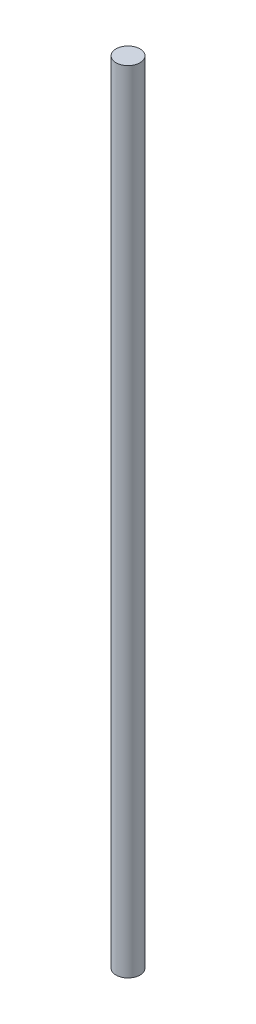
ISO-10303-21;
HEADER;
FILE_DESCRIPTION(('STEP AP214'),'2;1');
FILE_NAME('part.step','',(''),(''),'','','');
FILE_SCHEMA(('AUTOMOTIVE_DESIGN { 1 0 10303 214 1 1 1 1 }'));
ENDSEC;
DATA;
#1=APPLICATION_CONTEXT('core data for automotive mechanical design processes');
#2=APPLICATION_PROTOCOL_DEFINITION('international standard','automotive_design',2000,#1);
#3=PRODUCT_CONTEXT('',#1,'mechanical');
#4=PRODUCT('Part','Part','',(#3));
#5=PRODUCT_RELATED_PRODUCT_CATEGORY('part','',(#4));
#6=PRODUCT_DEFINITION_FORMATION('','',#4);
#7=PRODUCT_DEFINITION_CONTEXT('part definition',#1,'design');
#8=PRODUCT_DEFINITION('design','',#6,#7);
#9=PRODUCT_DEFINITION_SHAPE('','',#8);
#10=(LENGTH_UNIT() NAMED_UNIT(*) SI_UNIT(.MILLI.,.METRE.));
#11=(NAMED_UNIT(*) PLANE_ANGLE_UNIT() SI_UNIT($,.RADIAN.));
#12=(NAMED_UNIT(*) SI_UNIT($,.STERADIAN.) SOLID_ANGLE_UNIT());
#13=UNCERTAINTY_MEASURE_WITH_UNIT(LENGTH_MEASURE(1.E-05),#10,'distance_accuracy_value','');
#14=(GEOMETRIC_REPRESENTATION_CONTEXT(3) GLOBAL_UNCERTAINTY_ASSIGNED_CONTEXT((#13)) GLOBAL_UNIT_ASSIGNED_CONTEXT((#10,
#11,#12)) REPRESENTATION_CONTEXT('',''));
#15=CARTESIAN_POINT('',(0.,0.,0.));
#16=DIRECTION('',(0.,0.,1.));
#17=DIRECTION('',(1.,0.,0.));
#18=AXIS2_PLACEMENT_3D('',#15,#16,#17);
#19=CARTESIAN_POINT('',(21.,0.,18.));
#20=DIRECTION('',(0.,-1.,0.));
#21=DIRECTION('',(0.,0.,-1.));
#22=AXIS2_PLACEMENT_3D('',#19,#20,#21);
#23=PLANE('',#22);
#24=CARTESIAN_POINT('',(21.,0.,18.));
#25=DIRECTION('',(0.,-1.,0.));
#26=DIRECTION('',(0.,0.,-1.));
#27=AXIS2_PLACEMENT_3D('',#24,#25,#26);
#28=CIRCLE('',#27,6.);
#29=CARTESIAN_POINT('',(21.,0.,12.));
#30=VERTEX_POINT('',#29);
#31=EDGE_CURVE('E20',#30,#30,#28,.F.);
#32=ORIENTED_EDGE('',*,*,#31,.F.);
#33=EDGE_LOOP('',(#32));
#34=FACE_BOUND('',#33,.T.);
#35=ADVANCED_FACE('F16',(#34),#23,.T.);
#36=CARTESIAN_POINT('',(21.,395.,18.));
#37=DIRECTION('',(0.,1.,0.));
#38=DIRECTION('',(0.,0.,1.));
#39=AXIS2_PLACEMENT_3D('',#36,#37,#38);
#40=PLANE('',#39);
#41=CARTESIAN_POINT('',(21.,395.,18.));
#42=DIRECTION('',(0.,-1.,0.));
#43=DIRECTION('',(0.,0.,-1.));
#44=AXIS2_PLACEMENT_3D('',#41,#42,#43);
#45=CIRCLE('',#44,6.);
#46=CARTESIAN_POINT('',(21.,395.,12.));
#47=VERTEX_POINT('',#46);
#48=EDGE_CURVE('E11',#47,#47,#45,.T.);
#49=ORIENTED_EDGE('',*,*,#48,.F.);
#50=EDGE_LOOP('',(#49));
#51=FACE_BOUND('',#50,.T.);
#52=ADVANCED_FACE('F35',(#51),#40,.T.);
#53=CARTESIAN_POINT('',(21.,197.5,18.));
#54=DIRECTION('',(0.,-1.,0.));
#55=DIRECTION('',(0.,0.,-1.));
#56=AXIS2_PLACEMENT_3D('',#53,#54,#55);
#57=CYLINDRICAL_SURFACE('',#56,6.);
#58=ORIENTED_EDGE('',*,*,#31,.T.);
#59=EDGE_LOOP('',(#58));
#60=FACE_BOUND('',#59,.T.);
#61=ORIENTED_EDGE('',*,*,#48,.T.);
#62=EDGE_LOOP('',(#61));
#63=FACE_BOUND('',#62,.T.);
#64=ADVANCED_FACE('F32',(#60,#63),#57,.T.);
#65=CLOSED_SHELL('',(#35,#52,#64));
#66=MANIFOLD_SOLID_BREP('B1',#65);
#67=ADVANCED_BREP_SHAPE_REPRESENTATION('',(#18,#66),#14);
#68=SHAPE_DEFINITION_REPRESENTATION(#9,#67);
ENDSEC;
END-ISO-10303-21;
